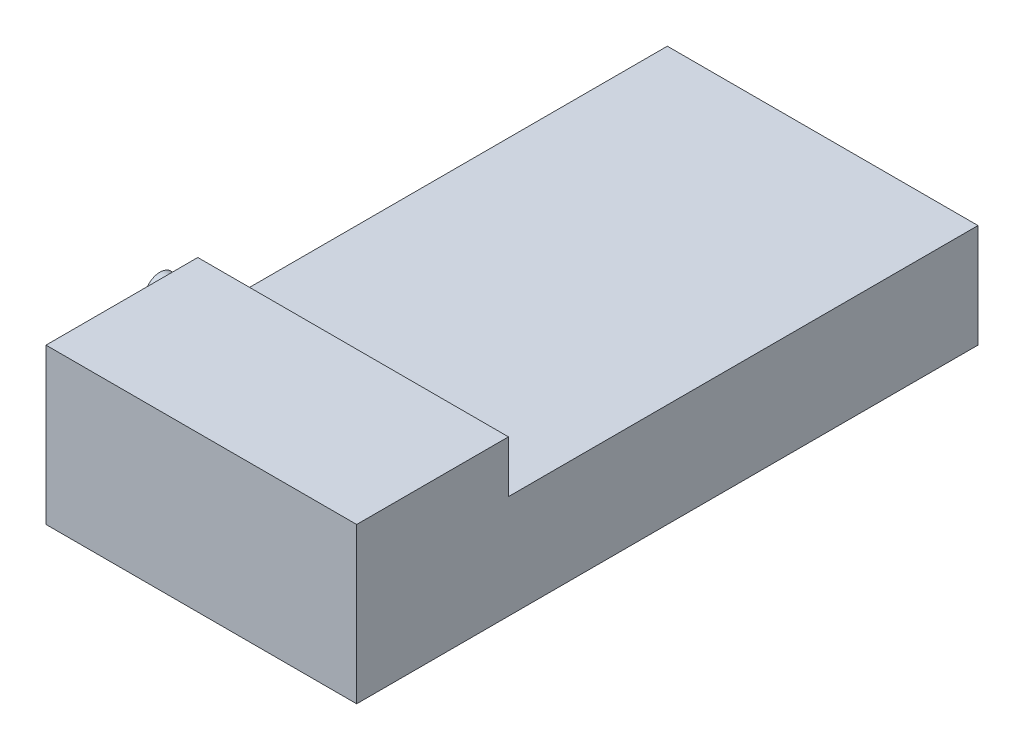
ISO-10303-21;
HEADER;
FILE_DESCRIPTION(('STEP AP214'),'2;1');
FILE_NAME('part.step','',(''),(''),'','','');
FILE_SCHEMA(('AUTOMOTIVE_DESIGN { 1 0 10303 214 1 1 1 1 }'));
ENDSEC;
DATA;
#1=APPLICATION_CONTEXT('core data for automotive mechanical design processes');
#2=APPLICATION_PROTOCOL_DEFINITION('international standard','automotive_design',2000,#1);
#3=PRODUCT_CONTEXT('',#1,'mechanical');
#4=PRODUCT('Part','Part','',(#3));
#5=PRODUCT_RELATED_PRODUCT_CATEGORY('part','',(#4));
#6=PRODUCT_DEFINITION_FORMATION('','',#4);
#7=PRODUCT_DEFINITION_CONTEXT('part definition',#1,'design');
#8=PRODUCT_DEFINITION('design','',#6,#7);
#9=PRODUCT_DEFINITION_SHAPE('','',#8);
#10=(LENGTH_UNIT() NAMED_UNIT(*) SI_UNIT(.MILLI.,.METRE.));
#11=(NAMED_UNIT(*) PLANE_ANGLE_UNIT() SI_UNIT($,.RADIAN.));
#12=(NAMED_UNIT(*) SI_UNIT($,.STERADIAN.) SOLID_ANGLE_UNIT());
#13=UNCERTAINTY_MEASURE_WITH_UNIT(LENGTH_MEASURE(1.E-05),#10,'distance_accuracy_value','');
#14=(GEOMETRIC_REPRESENTATION_CONTEXT(3) GLOBAL_UNCERTAINTY_ASSIGNED_CONTEXT((#13)) GLOBAL_UNIT_ASSIGNED_CONTEXT((#10,
#11,#12)) REPRESENTATION_CONTEXT('',''));
#15=CARTESIAN_POINT('',(0.,0.,0.));
#16=DIRECTION('',(0.,0.,1.));
#17=DIRECTION('',(1.,0.,0.));
#18=AXIS2_PLACEMENT_3D('',#15,#16,#17);
#19=CARTESIAN_POINT('',(0.,12.7,0.));
#20=DIRECTION('',(0.,-1.,0.));
#21=DIRECTION('',(0.,0.,-1.));
#22=AXIS2_PLACEMENT_3D('',#19,#20,#21);
#23=PLANE('',#22);
#24=DIRECTION('',(-1.,0.,0.));
#25=VECTOR('',#24,1.);
#26=CARTESIAN_POINT('',(38.1,12.7,-18.6146663541535));
#27=LINE('',#26,#25);
#28=CARTESIAN_POINT('',(38.1,12.7,-18.6146663541535));
#29=VERTEX_POINT('',#28);
#30=CARTESIAN_POINT('',(0.,12.7,-18.6146663541535));
#31=VERTEX_POINT('',#30);
#32=EDGE_CURVE('E48',#29,#31,#27,.T.);
#33=ORIENTED_EDGE('',*,*,#32,.F.);
#34=DIRECTION('',(0.,0.,-1.));
#35=VECTOR('',#34,1.);
#36=CARTESIAN_POINT('',(38.1,12.7,0.));
#37=LINE('',#36,#35);
#38=CARTESIAN_POINT('',(38.1,12.7,-76.2));
#39=VERTEX_POINT('',#38);
#40=EDGE_CURVE('E139',#29,#39,#37,.T.);
#41=ORIENTED_EDGE('',*,*,#40,.T.);
#42=DIRECTION('',(-1.,0.,0.));
#43=VECTOR('',#42,1.);
#44=CARTESIAN_POINT('',(0.,12.7,-76.2));
#45=LINE('',#44,#43);
#46=CARTESIAN_POINT('',(0.,12.7,-76.2));
#47=VERTEX_POINT('',#46);
#48=EDGE_CURVE('E54',#39,#47,#45,.T.);
#49=ORIENTED_EDGE('',*,*,#48,.T.);
#50=DIRECTION('',(0.,0.,1.));
#51=VECTOR('',#50,1.);
#52=CARTESIAN_POINT('',(0.,12.7,0.));
#53=LINE('',#52,#51);
#54=EDGE_CURVE('E83',#47,#31,#53,.T.);
#55=ORIENTED_EDGE('',*,*,#54,.T.);
#56=EDGE_LOOP('',(#33,#41,#49,#55));
#57=FACE_BOUND('',#56,.T.);
#58=ADVANCED_FACE('F33',(#57),#23,.F.);
#59=CARTESIAN_POINT('',(0.,12.7,0.));
#60=DIRECTION('',(1.,0.,0.));
#61=DIRECTION('',(0.,0.,-1.));
#62=AXIS2_PLACEMENT_3D('',#59,#60,#61);
#63=PLANE('',#62);
#64=CARTESIAN_POINT('',(0.,6.47860297701752,-25.4));
#65=DIRECTION('',(1.,0.,0.));
#66=DIRECTION('',(0.,0.,-1.));
#67=AXIS2_PLACEMENT_3D('',#64,#65,#66);
#68=CIRCLE('',#67,1.905);
#69=CARTESIAN_POINT('',(0.,6.47860297701752,-27.305));
#70=VERTEX_POINT('',#69);
#71=EDGE_CURVE('E11',#70,#70,#68,.F.);
#72=ORIENTED_EDGE('',*,*,#71,.F.);
#73=EDGE_LOOP('',(#72));
#74=FACE_BOUND('',#73,.T.);
#75=DIRECTION('',(0.,0.,1.));
#76=VECTOR('',#75,1.);
#77=CARTESIAN_POINT('',(0.,0.,0.));
#78=LINE('',#77,#76);
#79=CARTESIAN_POINT('',(0.,0.,-76.2));
#80=VERTEX_POINT('',#79);
#81=CARTESIAN_POINT('',(0.,0.,0.));
#82=VERTEX_POINT('',#81);
#83=EDGE_CURVE('E89',#80,#82,#78,.T.);
#84=ORIENTED_EDGE('',*,*,#83,.T.);
#85=DIRECTION('',(0.,-1.,0.));
#86=VECTOR('',#85,1.);
#87=CARTESIAN_POINT('',(0.,12.7,0.));
#88=LINE('',#87,#86);
#89=CARTESIAN_POINT('',(0.,19.05,0.));
#90=VERTEX_POINT('',#89);
#91=EDGE_CURVE('E41',#90,#82,#88,.T.);
#92=ORIENTED_EDGE('',*,*,#91,.F.);
#93=DIRECTION('',(0.,0.,1.));
#94=VECTOR('',#93,1.);
#95=CARTESIAN_POINT('',(0.,19.05,-18.6146663541535));
#96=LINE('',#95,#94);
#97=CARTESIAN_POINT('',(0.,19.05,-18.6146663541535));
#98=VERTEX_POINT('',#97);
#99=EDGE_CURVE('E118',#98,#90,#96,.T.);
#100=ORIENTED_EDGE('',*,*,#99,.F.);
#101=DIRECTION('',(0.,-1.,0.));
#102=VECTOR('',#101,1.);
#103=CARTESIAN_POINT('',(0.,15.24,-18.6146663541535));
#104=LINE('',#103,#102);
#105=EDGE_CURVE('E135',#98,#31,#104,.T.);
#106=ORIENTED_EDGE('',*,*,#105,.T.);
#107=ORIENTED_EDGE('',*,*,#54,.F.);
#108=DIRECTION('',(0.,-1.,0.));
#109=VECTOR('',#108,1.);
#110=CARTESIAN_POINT('',(0.,12.7,-76.2));
#111=LINE('',#110,#109);
#112=EDGE_CURVE('E76',#47,#80,#111,.T.);
#113=ORIENTED_EDGE('',*,*,#112,.T.);
#114=EDGE_LOOP('',(#84,#92,#100,#106,#107,#113));
#115=FACE_BOUND('',#114,.T.);
#116=ADVANCED_FACE('F35',(#74,#115),#63,.F.);
#117=CARTESIAN_POINT('',(0.,12.7,0.));
#118=DIRECTION('',(0.,0.,-1.));
#119=DIRECTION('',(-1.,0.,0.));
#120=AXIS2_PLACEMENT_3D('',#117,#118,#119);
#121=PLANE('',#120);
#122=DIRECTION('',(1.,0.,0.));
#123=VECTOR('',#122,1.);
#124=CARTESIAN_POINT('',(0.,0.,0.));
#125=LINE('',#124,#123);
#126=CARTESIAN_POINT('',(38.1,0.,0.));
#127=VERTEX_POINT('',#126);
#128=EDGE_CURVE('E93',#82,#127,#125,.T.);
#129=ORIENTED_EDGE('',*,*,#128,.T.);
#130=DIRECTION('',(0.,-1.,0.));
#131=VECTOR('',#130,1.);
#132=CARTESIAN_POINT('',(38.1,12.7,0.));
#133=LINE('',#132,#131);
#134=CARTESIAN_POINT('',(38.1,19.05,0.));
#135=VERTEX_POINT('',#134);
#136=EDGE_CURVE('E106',#135,#127,#133,.T.);
#137=ORIENTED_EDGE('',*,*,#136,.F.);
#138=DIRECTION('',(1.,0.,0.));
#139=VECTOR('',#138,1.);
#140=CARTESIAN_POINT('',(38.1,19.05,0.));
#141=LINE('',#140,#139);
#142=EDGE_CURVE('E114',#90,#135,#141,.T.);
#143=ORIENTED_EDGE('',*,*,#142,.F.);
#144=ORIENTED_EDGE('',*,*,#91,.T.);
#145=EDGE_LOOP('',(#129,#137,#143,#144));
#146=FACE_BOUND('',#145,.T.);
#147=ADVANCED_FACE('F110',(#146),#121,.F.);
#148=CARTESIAN_POINT('',(38.1,12.7,0.));
#149=DIRECTION('',(-1.,0.,0.));
#150=DIRECTION('',(0.,0.,1.));
#151=AXIS2_PLACEMENT_3D('',#148,#149,#150);
#152=PLANE('',#151);
#153=DIRECTION('',(0.,0.,-1.));
#154=VECTOR('',#153,1.);
#155=CARTESIAN_POINT('',(38.1,0.,0.));
#156=LINE('',#155,#154);
#157=CARTESIAN_POINT('',(38.1,0.,-76.2));
#158=VERTEX_POINT('',#157);
#159=EDGE_CURVE('E84',#127,#158,#156,.T.);
#160=ORIENTED_EDGE('',*,*,#159,.T.);
#161=DIRECTION('',(0.,-1.,0.));
#162=VECTOR('',#161,1.);
#163=CARTESIAN_POINT('',(38.1,12.7,-76.2));
#164=LINE('',#163,#162);
#165=EDGE_CURVE('E79',#39,#158,#164,.T.);
#166=ORIENTED_EDGE('',*,*,#165,.F.);
#167=ORIENTED_EDGE('',*,*,#40,.F.);
#168=DIRECTION('',(0.,-1.,0.));
#169=VECTOR('',#168,1.);
#170=CARTESIAN_POINT('',(38.1,15.24,-18.6146663541535));
#171=LINE('',#170,#169);
#172=CARTESIAN_POINT('',(38.1,19.05,-18.6146663541535));
#173=VERTEX_POINT('',#172);
#174=EDGE_CURVE('E99',#173,#29,#171,.T.);
#175=ORIENTED_EDGE('',*,*,#174,.F.);
#176=DIRECTION('',(0.,0.,-1.));
#177=VECTOR('',#176,1.);
#178=CARTESIAN_POINT('',(38.1,19.05,-18.6146663541535));
#179=LINE('',#178,#177);
#180=EDGE_CURVE('E130',#135,#173,#179,.T.);
#181=ORIENTED_EDGE('',*,*,#180,.F.);
#182=ORIENTED_EDGE('',*,*,#136,.T.);
#183=EDGE_LOOP('',(#160,#166,#167,#175,#181,#182));
#184=FACE_BOUND('',#183,.T.);
#185=ADVANCED_FACE('F142',(#184),#152,.F.);
#186=CARTESIAN_POINT('',(0.,12.7,-76.2));
#187=DIRECTION('',(0.,0.,1.));
#188=DIRECTION('',(1.,0.,0.));
#189=AXIS2_PLACEMENT_3D('',#186,#187,#188);
#190=PLANE('',#189);
#191=DIRECTION('',(-1.,0.,0.));
#192=VECTOR('',#191,1.);
#193=CARTESIAN_POINT('',(0.,0.,-76.2));
#194=LINE('',#193,#192);
#195=EDGE_CURVE('E73',#158,#80,#194,.T.);
#196=ORIENTED_EDGE('',*,*,#195,.T.);
#197=ORIENTED_EDGE('',*,*,#112,.F.);
#198=ORIENTED_EDGE('',*,*,#48,.F.);
#199=ORIENTED_EDGE('',*,*,#165,.T.);
#200=EDGE_LOOP('',(#196,#197,#198,#199));
#201=FACE_BOUND('',#200,.T.);
#202=ADVANCED_FACE('F75',(#201),#190,.F.);
#203=CARTESIAN_POINT('',(0.,0.,0.));
#204=DIRECTION('',(0.,-1.,0.));
#205=DIRECTION('',(0.,0.,-1.));
#206=AXIS2_PLACEMENT_3D('',#203,#204,#205);
#207=PLANE('',#206);
#208=ORIENTED_EDGE('',*,*,#83,.F.);
#209=ORIENTED_EDGE('',*,*,#195,.F.);
#210=ORIENTED_EDGE('',*,*,#159,.F.);
#211=ORIENTED_EDGE('',*,*,#128,.F.);
#212=EDGE_LOOP('',(#208,#209,#210,#211));
#213=FACE_BOUND('',#212,.T.);
#214=ADVANCED_FACE('F92',(#213),#207,.T.);
#215=CARTESIAN_POINT('',(-11.43,6.47860297701752,-25.4));
#216=DIRECTION('',(1.,0.,0.));
#217=DIRECTION('',(0.,0.,-1.));
#218=AXIS2_PLACEMENT_3D('',#215,#216,#217);
#219=CYLINDRICAL_SURFACE('',#218,1.905);
#220=CARTESIAN_POINT('',(-11.43,6.47860297701752,-25.4));
#221=DIRECTION('',(-1.,0.,0.));
#222=DIRECTION('',(0.,0.,1.));
#223=AXIS2_PLACEMENT_3D('',#220,#221,#222);
#224=CIRCLE('',#223,1.905);
#225=CARTESIAN_POINT('',(-11.43,6.47860297701752,-23.495));
#226=VERTEX_POINT('',#225);
#227=EDGE_CURVE('E95',#226,#226,#224,.T.);
#228=ORIENTED_EDGE('',*,*,#227,.F.);
#229=EDGE_LOOP('',(#228));
#230=FACE_BOUND('',#229,.T.);
#231=ORIENTED_EDGE('',*,*,#71,.T.);
#232=EDGE_LOOP('',(#231));
#233=FACE_BOUND('',#232,.T.);
#234=ADVANCED_FACE('F158',(#230,#233),#219,.T.);
#235=CARTESIAN_POINT('',(-11.43,6.47860297701752,-25.4));
#236=DIRECTION('',(-1.,0.,0.));
#237=DIRECTION('',(0.,0.,1.));
#238=AXIS2_PLACEMENT_3D('',#235,#236,#237);
#239=PLANE('',#238);
#240=ORIENTED_EDGE('',*,*,#227,.T.);
#241=EDGE_LOOP('',(#240));
#242=FACE_BOUND('',#241,.T.);
#243=ADVANCED_FACE('F151',(#242),#239,.T.);
#244=CARTESIAN_POINT('',(38.1,15.24,-18.6146663541535));
#245=DIRECTION('',(0.,0.,1.));
#246=DIRECTION('',(1.,0.,0.));
#247=AXIS2_PLACEMENT_3D('',#244,#245,#246);
#248=PLANE('',#247);
#249=ORIENTED_EDGE('',*,*,#32,.T.);
#250=ORIENTED_EDGE('',*,*,#105,.F.);
#251=DIRECTION('',(-1.,0.,0.));
#252=VECTOR('',#251,1.);
#253=CARTESIAN_POINT('',(38.1,19.05,-18.6146663541535));
#254=LINE('',#253,#252);
#255=EDGE_CURVE('E127',#173,#98,#254,.T.);
#256=ORIENTED_EDGE('',*,*,#255,.F.);
#257=ORIENTED_EDGE('',*,*,#174,.T.);
#258=EDGE_LOOP('',(#249,#250,#256,#257));
#259=FACE_BOUND('',#258,.T.);
#260=ADVANCED_FACE('F149',(#259),#248,.F.);
#261=CARTESIAN_POINT('',(0.,19.05,0.));
#262=DIRECTION('',(0.,-1.,0.));
#263=DIRECTION('',(0.,0.,-1.));
#264=AXIS2_PLACEMENT_3D('',#261,#262,#263);
#265=PLANE('',#264);
#266=ORIENTED_EDGE('',*,*,#180,.T.);
#267=ORIENTED_EDGE('',*,*,#255,.T.);
#268=ORIENTED_EDGE('',*,*,#99,.T.);
#269=ORIENTED_EDGE('',*,*,#142,.T.);
#270=EDGE_LOOP('',(#266,#267,#268,#269));
#271=FACE_BOUND('',#270,.T.);
#272=ADVANCED_FACE('F124',(#271),#265,.F.);
#273=CLOSED_SHELL('',(#58,#116,#147,#185,#202,#214,#234,#243,#260,#272));
#274=MANIFOLD_SOLID_BREP('B2',#273);
#275=ADVANCED_BREP_SHAPE_REPRESENTATION('',(#18,#274),#14);
#276=SHAPE_DEFINITION_REPRESENTATION(#9,#275);
ENDSEC;
END-ISO-10303-21;
